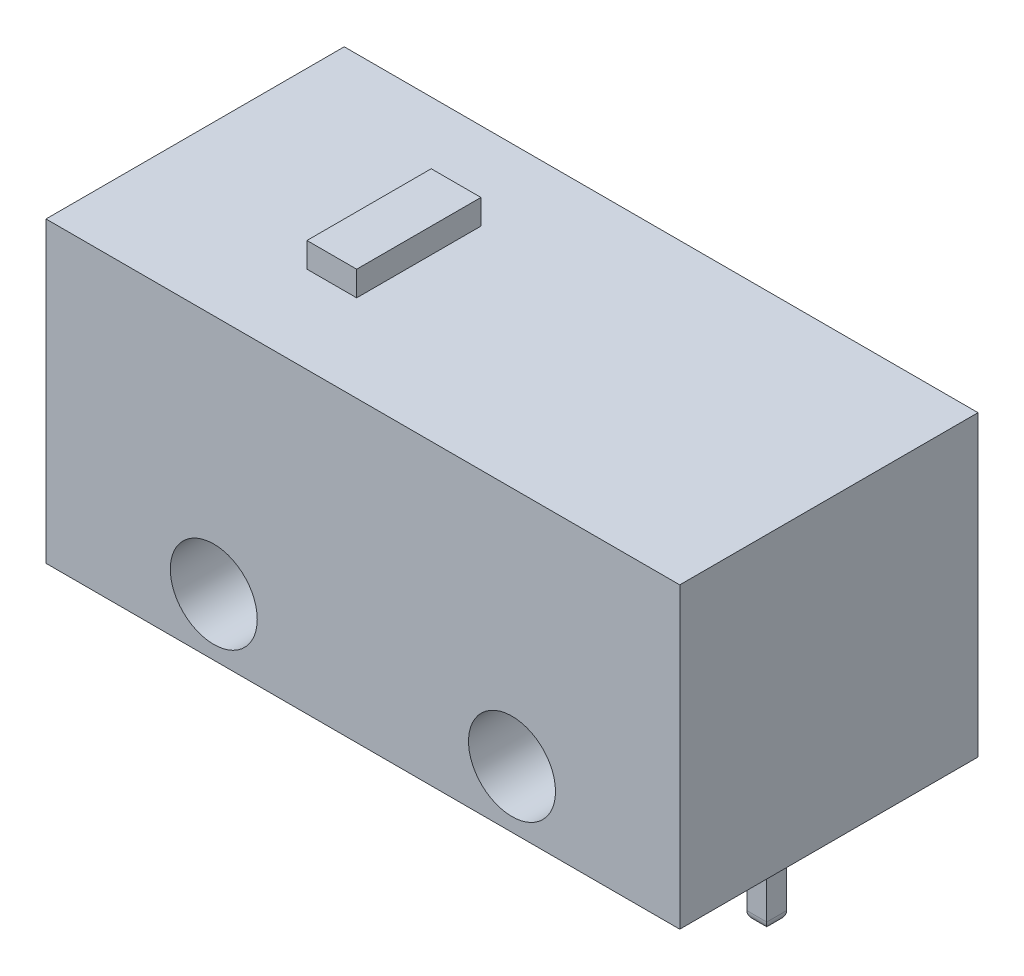
ISO-10303-21;
HEADER;
FILE_DESCRIPTION(('STEP AP214'),'2;1');
FILE_NAME('part.step','',(''),(''),'','','');
FILE_SCHEMA(('AUTOMOTIVE_DESIGN { 1 0 10303 214 1 1 1 1 }'));
ENDSEC;
DATA;
#1=APPLICATION_CONTEXT('core data for automotive mechanical design processes');
#2=APPLICATION_PROTOCOL_DEFINITION('international standard','automotive_design',2000,#1);
#3=PRODUCT_CONTEXT('',#1,'mechanical');
#4=PRODUCT('Part','Part','',(#3));
#5=PRODUCT_RELATED_PRODUCT_CATEGORY('part','',(#4));
#6=PRODUCT_DEFINITION_FORMATION('','',#4);
#7=PRODUCT_DEFINITION_CONTEXT('part definition',#1,'design');
#8=PRODUCT_DEFINITION('design','',#6,#7);
#9=PRODUCT_DEFINITION_SHAPE('','',#8);
#10=(LENGTH_UNIT() NAMED_UNIT(*) SI_UNIT(.MILLI.,.METRE.));
#11=(NAMED_UNIT(*) PLANE_ANGLE_UNIT() SI_UNIT($,.RADIAN.));
#12=(NAMED_UNIT(*) SI_UNIT($,.STERADIAN.) SOLID_ANGLE_UNIT());
#13=UNCERTAINTY_MEASURE_WITH_UNIT(LENGTH_MEASURE(1.E-05),#10,'distance_accuracy_value','');
#14=(GEOMETRIC_REPRESENTATION_CONTEXT(3) GLOBAL_UNCERTAINTY_ASSIGNED_CONTEXT((#13)) GLOBAL_UNIT_ASSIGNED_CONTEXT((#10,
#11,#12)) REPRESENTATION_CONTEXT('',''));
#15=CARTESIAN_POINT('',(0.,0.,0.));
#16=DIRECTION('',(0.,0.,1.));
#17=DIRECTION('',(1.,0.,0.));
#18=AXIS2_PLACEMENT_3D('',#15,#16,#17);
#19=CARTESIAN_POINT('',(0.,0.,6.));
#20=DIRECTION('',(0.,1.,0.));
#21=DIRECTION('',(0.,0.,1.));
#22=AXIS2_PLACEMENT_3D('',#19,#20,#21);
#23=PLANE('',#22);
#24=DIRECTION('',(1.,0.,0.));
#25=VECTOR('',#24,1.);
#26=CARTESIAN_POINT('',(1.05,0.,2.8));
#27=LINE('',#26,#25);
#28=CARTESIAN_POINT('',(1.05,0.,2.8));
#29=VERTEX_POINT('',#28);
#30=CARTESIAN_POINT('',(1.45,0.,2.8));
#31=VERTEX_POINT('',#30);
#32=EDGE_CURVE('E274',#29,#31,#27,.T.);
#33=ORIENTED_EDGE('',*,*,#32,.F.);
#34=DIRECTION('',(0.,0.,1.));
#35=VECTOR('',#34,1.);
#36=CARTESIAN_POINT('',(1.05,0.,2.8));
#37=LINE('',#36,#35);
#38=CARTESIAN_POINT('',(1.05,0.,3.2));
#39=VERTEX_POINT('',#38);
#40=EDGE_CURVE('E265',#29,#39,#37,.T.);
#41=ORIENTED_EDGE('',*,*,#40,.T.);
#42=DIRECTION('',(1.,0.,0.));
#43=VECTOR('',#42,1.);
#44=CARTESIAN_POINT('',(1.05,0.,3.2));
#45=LINE('',#44,#43);
#46=CARTESIAN_POINT('',(1.45,0.,3.2));
#47=VERTEX_POINT('',#46);
#48=EDGE_CURVE('E268',#39,#47,#45,.T.);
#49=ORIENTED_EDGE('',*,*,#48,.T.);
#50=DIRECTION('',(0.,0.,-1.));
#51=VECTOR('',#50,1.);
#52=CARTESIAN_POINT('',(1.45,0.,3.2));
#53=LINE('',#52,#51);
#54=EDGE_CURVE('E271',#47,#31,#53,.T.);
#55=ORIENTED_EDGE('',*,*,#54,.T.);
#56=EDGE_LOOP('',(#33,#41,#49,#55));
#57=FACE_BOUND('',#56,.T.);
#58=DIRECTION('',(1.,0.,0.));
#59=VECTOR('',#58,1.);
#60=CARTESIAN_POINT('',(0.,0.,0.));
#61=LINE('',#60,#59);
#62=CARTESIAN_POINT('',(0.,0.,0.));
#63=VERTEX_POINT('',#62);
#64=CARTESIAN_POINT('',(12.75,0.,0.));
#65=VERTEX_POINT('',#64);
#66=EDGE_CURVE('E166',#63,#65,#61,.T.);
#67=ORIENTED_EDGE('',*,*,#66,.T.);
#68=DIRECTION('',(0.,0.,-1.));
#69=VECTOR('',#68,1.);
#70=CARTESIAN_POINT('',(12.75,0.,6.));
#71=LINE('',#70,#69);
#72=CARTESIAN_POINT('',(12.75,0.,6.));
#73=VERTEX_POINT('',#72);
#74=EDGE_CURVE('E149',#73,#65,#71,.T.);
#75=ORIENTED_EDGE('',*,*,#74,.F.);
#76=DIRECTION('',(1.,0.,0.));
#77=VECTOR('',#76,1.);
#78=CARTESIAN_POINT('',(0.,0.,6.));
#79=LINE('',#78,#77);
#80=CARTESIAN_POINT('',(0.,0.,6.));
#81=VERTEX_POINT('',#80);
#82=EDGE_CURVE('E178',#81,#73,#79,.T.);
#83=ORIENTED_EDGE('',*,*,#82,.F.);
#84=DIRECTION('',(0.,0.,-1.));
#85=VECTOR('',#84,1.);
#86=CARTESIAN_POINT('',(0.,0.,6.));
#87=LINE('',#86,#85);
#88=EDGE_CURVE('E146',#81,#63,#87,.T.);
#89=ORIENTED_EDGE('',*,*,#88,.T.);
#90=EDGE_LOOP('',(#67,#75,#83,#89));
#91=FACE_BOUND('',#90,.T.);
#92=DIRECTION('',(1.,0.,0.));
#93=VECTOR('',#92,1.);
#94=CARTESIAN_POINT('',(6.175,0.,2.8));
#95=LINE('',#94,#93);
#96=CARTESIAN_POINT('',(6.175,0.,2.8));
#97=VERTEX_POINT('',#96);
#98=CARTESIAN_POINT('',(6.575,0.,2.8));
#99=VERTEX_POINT('',#98);
#100=EDGE_CURVE('E251',#97,#99,#95,.T.);
#101=ORIENTED_EDGE('',*,*,#100,.F.);
#102=DIRECTION('',(0.,0.,1.));
#103=VECTOR('',#102,1.);
#104=CARTESIAN_POINT('',(6.175,0.,2.8));
#105=LINE('',#104,#103);
#106=CARTESIAN_POINT('',(6.175,0.,3.2));
#107=VERTEX_POINT('',#106);
#108=EDGE_CURVE('E242',#97,#107,#105,.T.);
#109=ORIENTED_EDGE('',*,*,#108,.T.);
#110=DIRECTION('',(1.,0.,0.));
#111=VECTOR('',#110,1.);
#112=CARTESIAN_POINT('',(6.175,0.,3.2));
#113=LINE('',#112,#111);
#114=CARTESIAN_POINT('',(6.575,0.,3.2));
#115=VERTEX_POINT('',#114);
#116=EDGE_CURVE('E245',#107,#115,#113,.T.);
#117=ORIENTED_EDGE('',*,*,#116,.T.);
#118=DIRECTION('',(0.,0.,-1.));
#119=VECTOR('',#118,1.);
#120=CARTESIAN_POINT('',(6.575,0.,3.2));
#121=LINE('',#120,#119);
#122=EDGE_CURVE('E248',#115,#99,#121,.T.);
#123=ORIENTED_EDGE('',*,*,#122,.T.);
#124=EDGE_LOOP('',(#101,#109,#117,#123));
#125=FACE_BOUND('',#124,.T.);
#126=DIRECTION('',(1.,0.,0.));
#127=VECTOR('',#126,1.);
#128=CARTESIAN_POINT('',(11.7,0.,3.2));
#129=LINE('',#128,#127);
#130=CARTESIAN_POINT('',(11.7,0.,3.2));
#131=VERTEX_POINT('',#130);
#132=CARTESIAN_POINT('',(11.3,0.,3.2));
#133=VERTEX_POINT('',#132);
#134=EDGE_CURVE('E110',#131,#133,#129,.F.);
#135=ORIENTED_EDGE('',*,*,#134,.F.);
#136=DIRECTION('',(0.,0.,-1.));
#137=VECTOR('',#136,1.);
#138=CARTESIAN_POINT('',(11.7,0.,3.2));
#139=LINE('',#138,#137);
#140=CARTESIAN_POINT('',(11.7,0.,2.8));
#141=VERTEX_POINT('',#140);
#142=EDGE_CURVE('E289',#131,#141,#139,.T.);
#143=ORIENTED_EDGE('',*,*,#142,.T.);
#144=DIRECTION('',(1.,0.,0.));
#145=VECTOR('',#144,1.);
#146=CARTESIAN_POINT('',(11.7,0.,2.8));
#147=LINE('',#146,#145);
#148=CARTESIAN_POINT('',(11.3,0.,2.8));
#149=VERTEX_POINT('',#148);
#150=EDGE_CURVE('E292',#141,#149,#147,.F.);
#151=ORIENTED_EDGE('',*,*,#150,.T.);
#152=DIRECTION('',(0.,0.,1.));
#153=VECTOR('',#152,1.);
#154=CARTESIAN_POINT('',(11.3,0.,2.8));
#155=LINE('',#154,#153);
#156=EDGE_CURVE('E295',#149,#133,#155,.T.);
#157=ORIENTED_EDGE('',*,*,#156,.T.);
#158=EDGE_LOOP('',(#135,#143,#151,#157));
#159=FACE_BOUND('',#158,.T.);
#160=ADVANCED_FACE('F33',(#57,#91,#125,#159),#23,.F.);
#161=CARTESIAN_POINT('',(0.,6.,6.));
#162=DIRECTION('',(0.,-1.,0.));
#163=DIRECTION('',(0.,0.,-1.));
#164=AXIS2_PLACEMENT_3D('',#161,#162,#163);
#165=PLANE('',#164);
#166=DIRECTION('',(-1.,0.,0.));
#167=VECTOR('',#166,1.);
#168=CARTESIAN_POINT('',(0.,6.,0.));
#169=LINE('',#168,#167);
#170=CARTESIAN_POINT('',(12.75,6.,0.));
#171=VERTEX_POINT('',#170);
#172=CARTESIAN_POINT('',(0.,6.,0.));
#173=VERTEX_POINT('',#172);
#174=EDGE_CURVE('E159',#171,#173,#169,.T.);
#175=ORIENTED_EDGE('',*,*,#174,.T.);
#176=DIRECTION('',(0.,0.,-1.));
#177=VECTOR('',#176,1.);
#178=CARTESIAN_POINT('',(0.,6.,6.));
#179=LINE('',#178,#177);
#180=CARTESIAN_POINT('',(0.,6.,6.));
#181=VERTEX_POINT('',#180);
#182=EDGE_CURVE('E155',#181,#173,#179,.T.);
#183=ORIENTED_EDGE('',*,*,#182,.F.);
#184=DIRECTION('',(-1.,0.,0.));
#185=VECTOR('',#184,1.);
#186=CARTESIAN_POINT('',(0.,6.,6.));
#187=LINE('',#186,#185);
#188=CARTESIAN_POINT('',(12.75,6.,6.));
#189=VERTEX_POINT('',#188);
#190=EDGE_CURVE('E158',#189,#181,#187,.T.);
#191=ORIENTED_EDGE('',*,*,#190,.F.);
#192=DIRECTION('',(0.,0.,-1.));
#193=VECTOR('',#192,1.);
#194=CARTESIAN_POINT('',(12.75,6.,6.));
#195=LINE('',#194,#193);
#196=EDGE_CURVE('E152',#189,#171,#195,.T.);
#197=ORIENTED_EDGE('',*,*,#196,.T.);
#198=EDGE_LOOP('',(#175,#183,#191,#197));
#199=FACE_BOUND('',#198,.T.);
#200=DIRECTION('',(0.,0.,1.));
#201=VECTOR('',#200,1.);
#202=CARTESIAN_POINT('',(3.5,6.,1.75));
#203=LINE('',#202,#201);
#204=CARTESIAN_POINT('',(3.5,6.,1.75));
#205=VERTEX_POINT('',#204);
#206=CARTESIAN_POINT('',(3.5,6.,4.25));
#207=VERTEX_POINT('',#206);
#208=EDGE_CURVE('E217',#205,#207,#203,.T.);
#209=ORIENTED_EDGE('',*,*,#208,.F.);
#210=DIRECTION('',(-1.,0.,0.));
#211=VECTOR('',#210,1.);
#212=CARTESIAN_POINT('',(3.5,6.,1.75));
#213=LINE('',#212,#211);
#214=CARTESIAN_POINT('',(4.5,6.,1.75));
#215=VERTEX_POINT('',#214);
#216=EDGE_CURVE('E207',#215,#205,#213,.T.);
#217=ORIENTED_EDGE('',*,*,#216,.F.);
#218=DIRECTION('',(0.,0.,-1.));
#219=VECTOR('',#218,1.);
#220=CARTESIAN_POINT('',(4.5,6.,1.75));
#221=LINE('',#220,#219);
#222=CARTESIAN_POINT('',(4.5,6.,4.25));
#223=VERTEX_POINT('',#222);
#224=EDGE_CURVE('E211',#223,#215,#221,.T.);
#225=ORIENTED_EDGE('',*,*,#224,.F.);
#226=DIRECTION('',(1.,0.,0.));
#227=VECTOR('',#226,1.);
#228=CARTESIAN_POINT('',(3.5,6.,4.25));
#229=LINE('',#228,#227);
#230=EDGE_CURVE('E214',#207,#223,#229,.T.);
#231=ORIENTED_EDGE('',*,*,#230,.F.);
#232=EDGE_LOOP('',(#209,#217,#225,#231));
#233=FACE_BOUND('',#232,.T.);
#234=ADVANCED_FACE('F417',(#199,#233),#165,.F.);
#235=CARTESIAN_POINT('',(0.,0.,6.));
#236=DIRECTION('',(1.,0.,0.));
#237=DIRECTION('',(0.,0.,-1.));
#238=AXIS2_PLACEMENT_3D('',#235,#236,#237);
#239=PLANE('',#238);
#240=DIRECTION('',(0.,-1.,0.));
#241=VECTOR('',#240,1.);
#242=CARTESIAN_POINT('',(0.,0.,0.));
#243=LINE('',#242,#241);
#244=EDGE_CURVE('E169',#173,#63,#243,.T.);
#245=ORIENTED_EDGE('',*,*,#244,.T.);
#246=ORIENTED_EDGE('',*,*,#88,.F.);
#247=DIRECTION('',(0.,-1.,0.));
#248=VECTOR('',#247,1.);
#249=CARTESIAN_POINT('',(0.,0.,6.));
#250=LINE('',#249,#248);
#251=EDGE_CURVE('E162',#181,#81,#250,.T.);
#252=ORIENTED_EDGE('',*,*,#251,.F.);
#253=ORIENTED_EDGE('',*,*,#182,.T.);
#254=EDGE_LOOP('',(#245,#246,#252,#253));
#255=FACE_BOUND('',#254,.T.);
#256=ADVANCED_FACE('F422',(#255),#239,.F.);
#257=CARTESIAN_POINT('',(12.75,0.,6.));
#258=DIRECTION('',(-1.,0.,0.));
#259=DIRECTION('',(0.,0.,1.));
#260=AXIS2_PLACEMENT_3D('',#257,#258,#259);
#261=PLANE('',#260);
#262=DIRECTION('',(0.,1.,0.));
#263=VECTOR('',#262,1.);
#264=CARTESIAN_POINT('',(12.75,0.,0.));
#265=LINE('',#264,#263);
#266=EDGE_CURVE('E163',#65,#171,#265,.T.);
#267=ORIENTED_EDGE('',*,*,#266,.T.);
#268=ORIENTED_EDGE('',*,*,#196,.F.);
#269=DIRECTION('',(0.,1.,0.));
#270=VECTOR('',#269,1.);
#271=CARTESIAN_POINT('',(12.75,0.,6.));
#272=LINE('',#271,#270);
#273=EDGE_CURVE('E175',#73,#189,#272,.T.);
#274=ORIENTED_EDGE('',*,*,#273,.F.);
#275=ORIENTED_EDGE('',*,*,#74,.T.);
#276=EDGE_LOOP('',(#267,#268,#274,#275));
#277=FACE_BOUND('',#276,.T.);
#278=ADVANCED_FACE('F427',(#277),#261,.F.);
#279=CARTESIAN_POINT('',(0.,0.,6.));
#280=DIRECTION('',(0.,0.,-1.));
#281=DIRECTION('',(-1.,0.,0.));
#282=AXIS2_PLACEMENT_3D('',#279,#280,#281);
#283=PLANE('',#282);
#284=CARTESIAN_POINT('',(3.375,1.15,6.));
#285=DIRECTION('',(0.,0.,1.));
#286=DIRECTION('',(1.,0.,0.));
#287=AXIS2_PLACEMENT_3D('',#284,#285,#286);
#288=CIRCLE('',#287,0.874999999999999);
#289=CARTESIAN_POINT('',(4.25,1.15,6.));
#290=VERTEX_POINT('',#289);
#291=EDGE_CURVE('E191',#290,#290,#288,.T.);
#292=ORIENTED_EDGE('',*,*,#291,.F.);
#293=EDGE_LOOP('',(#292));
#294=FACE_BOUND('',#293,.T.);
#295=CARTESIAN_POINT('',(9.375,1.15,6.));
#296=DIRECTION('',(0.,0.,1.));
#297=DIRECTION('',(1.,0.,0.));
#298=AXIS2_PLACEMENT_3D('',#295,#296,#297);
#299=CIRCLE('',#298,0.874999999999999);
#300=CARTESIAN_POINT('',(10.25,1.15,6.));
#301=VERTEX_POINT('',#300);
#302=EDGE_CURVE('E185',#301,#301,#299,.T.);
#303=ORIENTED_EDGE('',*,*,#302,.F.);
#304=EDGE_LOOP('',(#303));
#305=FACE_BOUND('',#304,.T.);
#306=ORIENTED_EDGE('',*,*,#251,.T.);
#307=ORIENTED_EDGE('',*,*,#82,.T.);
#308=ORIENTED_EDGE('',*,*,#273,.T.);
#309=ORIENTED_EDGE('',*,*,#190,.T.);
#310=EDGE_LOOP('',(#306,#307,#308,#309));
#311=FACE_BOUND('',#310,.T.);
#312=ADVANCED_FACE('F682',(#294,#305,#311),#283,.F.);
#313=CARTESIAN_POINT('',(0.,0.,0.));
#314=DIRECTION('',(0.,0.,-1.));
#315=DIRECTION('',(-1.,0.,0.));
#316=AXIS2_PLACEMENT_3D('',#313,#314,#315);
#317=PLANE('',#316);
#318=CARTESIAN_POINT('',(3.375,1.15,0.));
#319=DIRECTION('',(0.,0.,1.));
#320=DIRECTION('',(1.,0.,0.));
#321=AXIS2_PLACEMENT_3D('',#318,#319,#320);
#322=CIRCLE('',#321,0.874999999999999);
#323=CARTESIAN_POINT('',(4.25,1.15,0.));
#324=VERTEX_POINT('',#323);
#325=EDGE_CURVE('E188',#324,#324,#322,.T.);
#326=ORIENTED_EDGE('',*,*,#325,.T.);
#327=EDGE_LOOP('',(#326));
#328=FACE_BOUND('',#327,.T.);
#329=CARTESIAN_POINT('',(9.375,1.15,0.));
#330=DIRECTION('',(0.,0.,1.));
#331=DIRECTION('',(1.,0.,0.));
#332=AXIS2_PLACEMENT_3D('',#329,#330,#331);
#333=CIRCLE('',#332,0.874999999999999);
#334=CARTESIAN_POINT('',(10.25,1.15,0.));
#335=VERTEX_POINT('',#334);
#336=EDGE_CURVE('E172',#335,#335,#333,.T.);
#337=ORIENTED_EDGE('',*,*,#336,.T.);
#338=EDGE_LOOP('',(#337));
#339=FACE_BOUND('',#338,.T.);
#340=ORIENTED_EDGE('',*,*,#244,.F.);
#341=ORIENTED_EDGE('',*,*,#174,.F.);
#342=ORIENTED_EDGE('',*,*,#266,.F.);
#343=ORIENTED_EDGE('',*,*,#66,.F.);
#344=EDGE_LOOP('',(#340,#341,#342,#343));
#345=FACE_BOUND('',#344,.T.);
#346=ADVANCED_FACE('F672',(#328,#339,#345),#317,.T.);
#347=CARTESIAN_POINT('',(9.375,1.15,6.));
#348=DIRECTION('',(0.,0.,1.));
#349=DIRECTION('',(1.,0.,0.));
#350=AXIS2_PLACEMENT_3D('',#347,#348,#349);
#351=CYLINDRICAL_SURFACE('',#350,0.874999999999999);
#352=ORIENTED_EDGE('',*,*,#336,.F.);
#353=EDGE_LOOP('',(#352));
#354=FACE_BOUND('',#353,.T.);
#355=ORIENTED_EDGE('',*,*,#302,.T.);
#356=EDGE_LOOP('',(#355));
#357=FACE_BOUND('',#356,.T.);
#358=ADVANCED_FACE('F662',(#354,#357),#351,.F.);
#359=CARTESIAN_POINT('',(3.375,1.15,6.));
#360=DIRECTION('',(0.,0.,1.));
#361=DIRECTION('',(1.,0.,0.));
#362=AXIS2_PLACEMENT_3D('',#359,#360,#361);
#363=CYLINDRICAL_SURFACE('',#362,0.874999999999999);
#364=ORIENTED_EDGE('',*,*,#325,.F.);
#365=EDGE_LOOP('',(#364));
#366=FACE_BOUND('',#365,.T.);
#367=ORIENTED_EDGE('',*,*,#291,.T.);
#368=EDGE_LOOP('',(#367));
#369=FACE_BOUND('',#368,.T.);
#370=ADVANCED_FACE('F646',(#366,#369),#363,.F.);
#371=CARTESIAN_POINT('',(3.5,6.5,1.75));
#372=DIRECTION('',(1.,0.,0.));
#373=DIRECTION('',(0.,0.,-1.));
#374=AXIS2_PLACEMENT_3D('',#371,#372,#373);
#375=PLANE('',#374);
#376=ORIENTED_EDGE('',*,*,#208,.T.);
#377=DIRECTION('',(0.,-1.,0.));
#378=VECTOR('',#377,1.);
#379=CARTESIAN_POINT('',(3.5,6.5,4.25));
#380=LINE('',#379,#378);
#381=CARTESIAN_POINT('',(3.5,6.5,4.25));
#382=VERTEX_POINT('',#381);
#383=EDGE_CURVE('E194',#382,#207,#380,.T.);
#384=ORIENTED_EDGE('',*,*,#383,.F.);
#385=DIRECTION('',(0.,0.,1.));
#386=VECTOR('',#385,1.);
#387=CARTESIAN_POINT('',(3.5,6.5,1.75));
#388=LINE('',#387,#386);
#389=CARTESIAN_POINT('',(3.5,6.5,1.75));
#390=VERTEX_POINT('',#389);
#391=EDGE_CURVE('E210',#390,#382,#388,.T.);
#392=ORIENTED_EDGE('',*,*,#391,.F.);
#393=DIRECTION('',(0.,-1.,0.));
#394=VECTOR('',#393,1.);
#395=CARTESIAN_POINT('',(3.5,6.5,1.75));
#396=LINE('',#395,#394);
#397=EDGE_CURVE('E203',#390,#205,#396,.T.);
#398=ORIENTED_EDGE('',*,*,#397,.T.);
#399=EDGE_LOOP('',(#376,#384,#392,#398));
#400=FACE_BOUND('',#399,.T.);
#401=ADVANCED_FACE('F636',(#400),#375,.F.);
#402=CARTESIAN_POINT('',(3.5,6.5,4.25));
#403=DIRECTION('',(0.,0.,-1.));
#404=DIRECTION('',(-1.,0.,0.));
#405=AXIS2_PLACEMENT_3D('',#402,#403,#404);
#406=PLANE('',#405);
#407=ORIENTED_EDGE('',*,*,#230,.T.);
#408=DIRECTION('',(0.,-1.,0.));
#409=VECTOR('',#408,1.);
#410=CARTESIAN_POINT('',(4.5,6.5,4.25));
#411=LINE('',#410,#409);
#412=CARTESIAN_POINT('',(4.5,6.5,4.25));
#413=VERTEX_POINT('',#412);
#414=EDGE_CURVE('E197',#413,#223,#411,.T.);
#415=ORIENTED_EDGE('',*,*,#414,.F.);
#416=DIRECTION('',(1.,0.,0.));
#417=VECTOR('',#416,1.);
#418=CARTESIAN_POINT('',(3.5,6.5,4.25));
#419=LINE('',#418,#417);
#420=EDGE_CURVE('E226',#382,#413,#419,.T.);
#421=ORIENTED_EDGE('',*,*,#420,.F.);
#422=ORIENTED_EDGE('',*,*,#383,.T.);
#423=EDGE_LOOP('',(#407,#415,#421,#422));
#424=FACE_BOUND('',#423,.T.);
#425=ADVANCED_FACE('F626',(#424),#406,.F.);
#426=CARTESIAN_POINT('',(4.5,6.5,1.75));
#427=DIRECTION('',(-1.,0.,0.));
#428=DIRECTION('',(0.,0.,1.));
#429=AXIS2_PLACEMENT_3D('',#426,#427,#428);
#430=PLANE('',#429);
#431=ORIENTED_EDGE('',*,*,#224,.T.);
#432=DIRECTION('',(0.,-1.,0.));
#433=VECTOR('',#432,1.);
#434=CARTESIAN_POINT('',(4.5,6.5,1.75));
#435=LINE('',#434,#433);
#436=CARTESIAN_POINT('',(4.5,6.5,1.75));
#437=VERTEX_POINT('',#436);
#438=EDGE_CURVE('E200',#437,#215,#435,.T.);
#439=ORIENTED_EDGE('',*,*,#438,.F.);
#440=DIRECTION('',(0.,0.,-1.));
#441=VECTOR('',#440,1.);
#442=CARTESIAN_POINT('',(4.5,6.5,1.75));
#443=LINE('',#442,#441);
#444=EDGE_CURVE('E223',#413,#437,#443,.T.);
#445=ORIENTED_EDGE('',*,*,#444,.F.);
#446=ORIENTED_EDGE('',*,*,#414,.T.);
#447=EDGE_LOOP('',(#431,#439,#445,#446));
#448=FACE_BOUND('',#447,.T.);
#449=ADVANCED_FACE('F616',(#448),#430,.F.);
#450=CARTESIAN_POINT('',(3.5,6.5,1.75));
#451=DIRECTION('',(0.,0.,1.));
#452=DIRECTION('',(1.,0.,0.));
#453=AXIS2_PLACEMENT_3D('',#450,#451,#452);
#454=PLANE('',#453);
#455=ORIENTED_EDGE('',*,*,#216,.T.);
#456=ORIENTED_EDGE('',*,*,#397,.F.);
#457=DIRECTION('',(-1.,0.,0.));
#458=VECTOR('',#457,1.);
#459=CARTESIAN_POINT('',(3.5,6.5,1.75));
#460=LINE('',#459,#458);
#461=EDGE_CURVE('E206',#437,#390,#460,.T.);
#462=ORIENTED_EDGE('',*,*,#461,.F.);
#463=ORIENTED_EDGE('',*,*,#438,.T.);
#464=EDGE_LOOP('',(#455,#456,#462,#463));
#465=FACE_BOUND('',#464,.T.);
#466=ADVANCED_FACE('F606',(#465),#454,.F.);
#467=CARTESIAN_POINT('',(0.,6.5,0.));
#468=DIRECTION('',(0.,1.,0.));
#469=DIRECTION('',(0.,0.,1.));
#470=AXIS2_PLACEMENT_3D('',#467,#468,#469);
#471=PLANE('',#470);
#472=ORIENTED_EDGE('',*,*,#391,.T.);
#473=ORIENTED_EDGE('',*,*,#420,.T.);
#474=ORIENTED_EDGE('',*,*,#444,.T.);
#475=ORIENTED_EDGE('',*,*,#461,.T.);
#476=EDGE_LOOP('',(#472,#473,#474,#475));
#477=FACE_BOUND('',#476,.T.);
#478=ADVANCED_FACE('F591',(#477),#471,.T.);
#479=CARTESIAN_POINT('',(6.175,-2.,2.8));
#480=DIRECTION('',(0.,0.,1.));
#481=DIRECTION('',(1.,0.,0.));
#482=AXIS2_PLACEMENT_3D('',#479,#480,#481);
#483=PLANE('',#482);
#484=DIRECTION('',(0.,1.,0.));
#485=VECTOR('',#484,1.);
#486=CARTESIAN_POINT('',(6.575,-2.,2.8));
#487=LINE('',#486,#485);
#488=CARTESIAN_POINT('',(6.575,-1.8,2.8));
#489=VERTEX_POINT('',#488);
#490=EDGE_CURVE('E220',#489,#99,#487,.T.);
#491=ORIENTED_EDGE('',*,*,#490,.F.);
#492=DIRECTION('',(1.,0.,0.));
#493=VECTOR('',#492,1.);
#494=CARTESIAN_POINT('',(6.175,-1.8,2.8));
#495=LINE('',#494,#493);
#496=CARTESIAN_POINT('',(6.175,-1.8,2.8));
#497=VERTEX_POINT('',#496);
#498=EDGE_CURVE('E122',#489,#497,#495,.F.);
#499=ORIENTED_EDGE('',*,*,#498,.T.);
#500=DIRECTION('',(0.,1.,0.));
#501=VECTOR('',#500,1.);
#502=CARTESIAN_POINT('',(6.175,-2.,2.8));
#503=LINE('',#502,#501);
#504=EDGE_CURVE('E239',#497,#97,#503,.T.);
#505=ORIENTED_EDGE('',*,*,#504,.T.);
#506=ORIENTED_EDGE('',*,*,#100,.T.);
#507=EDGE_LOOP('',(#491,#499,#505,#506));
#508=FACE_BOUND('',#507,.T.);
#509=ADVANCED_FACE('F582',(#508),#483,.F.);
#510=CARTESIAN_POINT('',(6.575,-2.,3.2));
#511=DIRECTION('',(1.,0.,0.));
#512=DIRECTION('',(0.,0.,-1.));
#513=AXIS2_PLACEMENT_3D('',#510,#511,#512);
#514=PLANE('',#513);
#515=DIRECTION('',(0.,1.,0.));
#516=VECTOR('',#515,1.);
#517=CARTESIAN_POINT('',(6.575,-2.,3.2));
#518=LINE('',#517,#516);
#519=CARTESIAN_POINT('',(6.575,-1.8,3.2));
#520=VERTEX_POINT('',#519);
#521=EDGE_CURVE('E233',#520,#115,#518,.T.);
#522=ORIENTED_EDGE('',*,*,#521,.F.);
#523=DIRECTION('',(0.,0.,-1.));
#524=VECTOR('',#523,1.);
#525=CARTESIAN_POINT('',(6.575,-1.8,2.8));
#526=LINE('',#525,#524);
#527=EDGE_CURVE('E125',#520,#489,#526,.T.);
#528=ORIENTED_EDGE('',*,*,#527,.T.);
#529=ORIENTED_EDGE('',*,*,#490,.T.);
#530=ORIENTED_EDGE('',*,*,#122,.F.);
#531=EDGE_LOOP('',(#522,#528,#529,#530));
#532=FACE_BOUND('',#531,.T.);
#533=ADVANCED_FACE('F572',(#532),#514,.T.);
#534=CARTESIAN_POINT('',(6.175,-2.,3.2));
#535=DIRECTION('',(0.,0.,1.));
#536=DIRECTION('',(1.,0.,0.));
#537=AXIS2_PLACEMENT_3D('',#534,#535,#536);
#538=PLANE('',#537);
#539=DIRECTION('',(0.,1.,0.));
#540=VECTOR('',#539,1.);
#541=CARTESIAN_POINT('',(6.175,-2.,3.2));
#542=LINE('',#541,#540);
#543=CARTESIAN_POINT('',(6.175,-1.8,3.2));
#544=VERTEX_POINT('',#543);
#545=EDGE_CURVE('E236',#544,#107,#542,.T.);
#546=ORIENTED_EDGE('',*,*,#545,.F.);
#547=DIRECTION('',(1.,0.,0.));
#548=VECTOR('',#547,1.);
#549=CARTESIAN_POINT('',(6.575,-1.8,3.2));
#550=LINE('',#549,#548);
#551=EDGE_CURVE('E128',#544,#520,#550,.T.);
#552=ORIENTED_EDGE('',*,*,#551,.T.);
#553=ORIENTED_EDGE('',*,*,#521,.T.);
#554=ORIENTED_EDGE('',*,*,#116,.F.);
#555=EDGE_LOOP('',(#546,#552,#553,#554));
#556=FACE_BOUND('',#555,.T.);
#557=ADVANCED_FACE('F562',(#556),#538,.T.);
#558=CARTESIAN_POINT('',(6.175,-2.,2.8));
#559=DIRECTION('',(-1.,0.,0.));
#560=DIRECTION('',(0.,0.,1.));
#561=AXIS2_PLACEMENT_3D('',#558,#559,#560);
#562=PLANE('',#561);
#563=ORIENTED_EDGE('',*,*,#504,.F.);
#564=DIRECTION('',(0.,0.,1.));
#565=VECTOR('',#564,1.);
#566=CARTESIAN_POINT('',(6.175,-1.8,3.2));
#567=LINE('',#566,#565);
#568=EDGE_CURVE('E131',#497,#544,#567,.T.);
#569=ORIENTED_EDGE('',*,*,#568,.T.);
#570=ORIENTED_EDGE('',*,*,#545,.T.);
#571=ORIENTED_EDGE('',*,*,#108,.F.);
#572=EDGE_LOOP('',(#563,#569,#570,#571));
#573=FACE_BOUND('',#572,.T.);
#574=ADVANCED_FACE('F553',(#573),#562,.T.);
#575=CARTESIAN_POINT('',(1.05,-2.,2.8));
#576=DIRECTION('',(0.,0.,1.));
#577=DIRECTION('',(1.,0.,0.));
#578=AXIS2_PLACEMENT_3D('',#575,#576,#577);
#579=PLANE('',#578);
#580=DIRECTION('',(0.,1.,0.));
#581=VECTOR('',#580,1.);
#582=CARTESIAN_POINT('',(1.45,-2.,2.8));
#583=LINE('',#582,#581);
#584=CARTESIAN_POINT('',(1.45,-1.8,2.8));
#585=VERTEX_POINT('',#584);
#586=EDGE_CURVE('E254',#585,#31,#583,.T.);
#587=ORIENTED_EDGE('',*,*,#586,.F.);
#588=DIRECTION('',(1.,0.,0.));
#589=VECTOR('',#588,1.);
#590=CARTESIAN_POINT('',(1.05,-1.8,2.8));
#591=LINE('',#590,#589);
#592=CARTESIAN_POINT('',(1.05,-1.8,2.8));
#593=VERTEX_POINT('',#592);
#594=EDGE_CURVE('E11',#585,#593,#591,.F.);
#595=ORIENTED_EDGE('',*,*,#594,.T.);
#596=DIRECTION('',(0.,1.,0.));
#597=VECTOR('',#596,1.);
#598=CARTESIAN_POINT('',(1.05,-2.,2.8));
#599=LINE('',#598,#597);
#600=EDGE_CURVE('E262',#593,#29,#599,.T.);
#601=ORIENTED_EDGE('',*,*,#600,.T.);
#602=ORIENTED_EDGE('',*,*,#32,.T.);
#603=EDGE_LOOP('',(#587,#595,#601,#602));
#604=FACE_BOUND('',#603,.T.);
#605=ADVANCED_FACE('F395',(#604),#579,.F.);
#606=CARTESIAN_POINT('',(1.45,-2.,3.2));
#607=DIRECTION('',(1.,0.,0.));
#608=DIRECTION('',(0.,0.,-1.));
#609=AXIS2_PLACEMENT_3D('',#606,#607,#608);
#610=PLANE('',#609);
#611=DIRECTION('',(0.,1.,0.));
#612=VECTOR('',#611,1.);
#613=CARTESIAN_POINT('',(1.45,-2.,3.2));
#614=LINE('',#613,#612);
#615=CARTESIAN_POINT('',(1.45,-1.8,3.2));
#616=VERTEX_POINT('',#615);
#617=EDGE_CURVE('E256',#616,#47,#614,.T.);
#618=ORIENTED_EDGE('',*,*,#617,.F.);
#619=DIRECTION('',(0.,0.,-1.));
#620=VECTOR('',#619,1.);
#621=CARTESIAN_POINT('',(1.45,-1.8,2.8));
#622=LINE('',#621,#620);
#623=EDGE_CURVE('E43',#616,#585,#622,.T.);
#624=ORIENTED_EDGE('',*,*,#623,.T.);
#625=ORIENTED_EDGE('',*,*,#586,.T.);
#626=ORIENTED_EDGE('',*,*,#54,.F.);
#627=EDGE_LOOP('',(#618,#624,#625,#626));
#628=FACE_BOUND('',#627,.T.);
#629=ADVANCED_FACE('F405',(#628),#610,.T.);
#630=CARTESIAN_POINT('',(1.05,-2.,3.2));
#631=DIRECTION('',(0.,0.,1.));
#632=DIRECTION('',(1.,0.,0.));
#633=AXIS2_PLACEMENT_3D('',#630,#631,#632);
#634=PLANE('',#633);
#635=DIRECTION('',(0.,1.,0.));
#636=VECTOR('',#635,1.);
#637=CARTESIAN_POINT('',(1.05,-2.,3.2));
#638=LINE('',#637,#636);
#639=CARTESIAN_POINT('',(1.05,-1.8,3.2));
#640=VERTEX_POINT('',#639);
#641=EDGE_CURVE('E259',#640,#39,#638,.T.);
#642=ORIENTED_EDGE('',*,*,#641,.F.);
#643=DIRECTION('',(1.,0.,0.));
#644=VECTOR('',#643,1.);
#645=CARTESIAN_POINT('',(1.45,-1.8,3.2));
#646=LINE('',#645,#644);
#647=EDGE_CURVE('E95',#640,#616,#646,.T.);
#648=ORIENTED_EDGE('',*,*,#647,.T.);
#649=ORIENTED_EDGE('',*,*,#617,.T.);
#650=ORIENTED_EDGE('',*,*,#48,.F.);
#651=EDGE_LOOP('',(#642,#648,#649,#650));
#652=FACE_BOUND('',#651,.T.);
#653=ADVANCED_FACE('F407',(#652),#634,.T.);
#654=CARTESIAN_POINT('',(1.05,-2.,2.8));
#655=DIRECTION('',(-1.,0.,0.));
#656=DIRECTION('',(0.,0.,1.));
#657=AXIS2_PLACEMENT_3D('',#654,#655,#656);
#658=PLANE('',#657);
#659=ORIENTED_EDGE('',*,*,#600,.F.);
#660=DIRECTION('',(0.,0.,1.));
#661=VECTOR('',#660,1.);
#662=CARTESIAN_POINT('',(1.05,-1.8,3.2));
#663=LINE('',#662,#661);
#664=EDGE_CURVE('E92',#593,#640,#663,.T.);
#665=ORIENTED_EDGE('',*,*,#664,.T.);
#666=ORIENTED_EDGE('',*,*,#641,.T.);
#667=ORIENTED_EDGE('',*,*,#40,.F.);
#668=EDGE_LOOP('',(#659,#665,#666,#667));
#669=FACE_BOUND('',#668,.T.);
#670=ADVANCED_FACE('F398',(#669),#658,.T.);
#671=CARTESIAN_POINT('',(11.7,-2.,3.2));
#672=DIRECTION('',(0.,0.,-1.));
#673=DIRECTION('',(-1.,0.,0.));
#674=AXIS2_PLACEMENT_3D('',#671,#672,#673);
#675=PLANE('',#674);
#676=DIRECTION('',(0.,1.,0.));
#677=VECTOR('',#676,1.);
#678=CARTESIAN_POINT('',(11.3,-2.,3.2));
#679=LINE('',#678,#677);
#680=CARTESIAN_POINT('',(11.3,-1.8,3.2));
#681=VERTEX_POINT('',#680);
#682=EDGE_CURVE('E277',#681,#133,#679,.T.);
#683=ORIENTED_EDGE('',*,*,#682,.F.);
#684=DIRECTION('',(-1.,0.,0.));
#685=VECTOR('',#684,1.);
#686=CARTESIAN_POINT('',(11.7,-1.8,3.2));
#687=LINE('',#686,#685);
#688=CARTESIAN_POINT('',(11.7,-1.8,3.2));
#689=VERTEX_POINT('',#688);
#690=EDGE_CURVE('E134',#681,#689,#687,.F.);
#691=ORIENTED_EDGE('',*,*,#690,.T.);
#692=DIRECTION('',(0.,1.,0.));
#693=VECTOR('',#692,1.);
#694=CARTESIAN_POINT('',(11.7,-2.,3.2));
#695=LINE('',#694,#693);
#696=EDGE_CURVE('E286',#689,#131,#695,.T.);
#697=ORIENTED_EDGE('',*,*,#696,.T.);
#698=ORIENTED_EDGE('',*,*,#134,.T.);
#699=EDGE_LOOP('',(#683,#691,#697,#698));
#700=FACE_BOUND('',#699,.T.);
#701=ADVANCED_FACE('F302',(#700),#675,.F.);
#702=CARTESIAN_POINT('',(11.3,-2.,2.8));
#703=DIRECTION('',(-1.,0.,0.));
#704=DIRECTION('',(0.,0.,1.));
#705=AXIS2_PLACEMENT_3D('',#702,#703,#704);
#706=PLANE('',#705);
#707=DIRECTION('',(0.,1.,0.));
#708=VECTOR('',#707,1.);
#709=CARTESIAN_POINT('',(11.3,-2.,2.8));
#710=LINE('',#709,#708);
#711=CARTESIAN_POINT('',(11.3,-1.8,2.8));
#712=VERTEX_POINT('',#711);
#713=EDGE_CURVE('E280',#712,#149,#710,.T.);
#714=ORIENTED_EDGE('',*,*,#713,.F.);
#715=DIRECTION('',(0.,0.,1.));
#716=VECTOR('',#715,1.);
#717=CARTESIAN_POINT('',(11.3,-1.8,2.8));
#718=LINE('',#717,#716);
#719=EDGE_CURVE('E137',#712,#681,#718,.T.);
#720=ORIENTED_EDGE('',*,*,#719,.T.);
#721=ORIENTED_EDGE('',*,*,#682,.T.);
#722=ORIENTED_EDGE('',*,*,#156,.F.);
#723=EDGE_LOOP('',(#714,#720,#721,#722));
#724=FACE_BOUND('',#723,.T.);
#725=ADVANCED_FACE('F315',(#724),#706,.T.);
#726=CARTESIAN_POINT('',(11.7,-2.,2.8));
#727=DIRECTION('',(0.,0.,-1.));
#728=DIRECTION('',(-1.,0.,0.));
#729=AXIS2_PLACEMENT_3D('',#726,#727,#728);
#730=PLANE('',#729);
#731=DIRECTION('',(0.,1.,0.));
#732=VECTOR('',#731,1.);
#733=CARTESIAN_POINT('',(11.7,-2.,2.8));
#734=LINE('',#733,#732);
#735=CARTESIAN_POINT('',(11.7,-1.8,2.8));
#736=VERTEX_POINT('',#735);
#737=EDGE_CURVE('E283',#736,#141,#734,.T.);
#738=ORIENTED_EDGE('',*,*,#737,.F.);
#739=DIRECTION('',(-1.,0.,0.));
#740=VECTOR('',#739,1.);
#741=CARTESIAN_POINT('',(11.7,-1.8,2.8));
#742=LINE('',#741,#740);
#743=EDGE_CURVE('E140',#736,#712,#742,.T.);
#744=ORIENTED_EDGE('',*,*,#743,.T.);
#745=ORIENTED_EDGE('',*,*,#713,.T.);
#746=ORIENTED_EDGE('',*,*,#150,.F.);
#747=EDGE_LOOP('',(#738,#744,#745,#746));
#748=FACE_BOUND('',#747,.T.);
#749=ADVANCED_FACE('F510',(#748),#730,.T.);
#750=CARTESIAN_POINT('',(11.7,-2.,3.2));
#751=DIRECTION('',(1.,0.,0.));
#752=DIRECTION('',(0.,0.,-1.));
#753=AXIS2_PLACEMENT_3D('',#750,#751,#752);
#754=PLANE('',#753);
#755=ORIENTED_EDGE('',*,*,#696,.F.);
#756=DIRECTION('',(0.,0.,-1.));
#757=VECTOR('',#756,1.);
#758=CARTESIAN_POINT('',(11.7,-1.8,3.2));
#759=LINE('',#758,#757);
#760=EDGE_CURVE('E143',#689,#736,#759,.T.);
#761=ORIENTED_EDGE('',*,*,#760,.T.);
#762=ORIENTED_EDGE('',*,*,#737,.T.);
#763=ORIENTED_EDGE('',*,*,#142,.F.);
#764=EDGE_LOOP('',(#755,#761,#762,#763));
#765=FACE_BOUND('',#764,.T.);
#766=ADVANCED_FACE('F447',(#765),#754,.T.);
#767=CARTESIAN_POINT('',(11.5,-1.8,2.8));
#768=DIRECTION('',(0.,0.,1.));
#769=DIRECTION('',(1.,0.,0.));
#770=AXIS2_PLACEMENT_3D('',#767,#768,#769);
#771=CYLINDRICAL_SURFACE('',#770,0.2);
#772=CARTESIAN_POINT('',(11.5,-1.8,3.));
#773=DIRECTION('',(0.707106781186547,0.,0.707106781186547));
#774=DIRECTION('',(0.707106781186547,0.,-0.707106781186547));
#775=AXIS2_PLACEMENT_3D('',#772,#773,#774);
#776=ELLIPSE('',#775,0.282842712474619,0.2);
#777=CARTESIAN_POINT('',(11.5,-2.,3.));
#778=VERTEX_POINT('',#777);
#779=EDGE_CURVE('E108',#681,#778,#776,.T.);
#780=ORIENTED_EDGE('',*,*,#779,.F.);
#781=ORIENTED_EDGE('',*,*,#719,.F.);
#782=CARTESIAN_POINT('',(11.5,-1.8,3.));
#783=DIRECTION('',(-0.707106781186547,0.,0.707106781186547));
#784=DIRECTION('',(0.707106781186547,0.,0.707106781186547));
#785=AXIS2_PLACEMENT_3D('',#782,#783,#784);
#786=ELLIPSE('',#785,0.282842712474619,0.2);
#787=EDGE_CURVE('E111',#778,#712,#786,.F.);
#788=ORIENTED_EDGE('',*,*,#787,.F.);
#789=EDGE_LOOP('',(#780,#781,#788));
#790=FACE_BOUND('',#789,.T.);
#791=ADVANCED_FACE('F443',(#790),#771,.T.);
#792=CARTESIAN_POINT('',(0.,-1.8,3.));
#793=DIRECTION('',(1.,0.,0.));
#794=DIRECTION('',(0.,0.,-1.));
#795=AXIS2_PLACEMENT_3D('',#792,#793,#794);
#796=CYLINDRICAL_SURFACE('',#795,0.2);
#797=ORIENTED_EDGE('',*,*,#690,.F.);
#798=ORIENTED_EDGE('',*,*,#779,.T.);
#799=CARTESIAN_POINT('',(11.5,-1.8,3.));
#800=DIRECTION('',(0.707106781186547,0.,-0.707106781186547));
#801=DIRECTION('',(0.707106781186547,0.,0.707106781186547));
#802=AXIS2_PLACEMENT_3D('',#799,#800,#801);
#803=ELLIPSE('',#802,0.282842712474619,0.2);
#804=EDGE_CURVE('E114',#689,#778,#803,.T.);
#805=ORIENTED_EDGE('',*,*,#804,.F.);
#806=EDGE_LOOP('',(#797,#798,#805));
#807=FACE_BOUND('',#806,.T.);
#808=ADVANCED_FACE('F439',(#807),#796,.T.);
#809=CARTESIAN_POINT('',(11.7,-1.8,3.));
#810=DIRECTION('',(-1.,0.,0.));
#811=DIRECTION('',(0.,0.,1.));
#812=AXIS2_PLACEMENT_3D('',#809,#810,#811);
#813=CYLINDRICAL_SURFACE('',#812,0.2);
#814=ORIENTED_EDGE('',*,*,#787,.T.);
#815=ORIENTED_EDGE('',*,*,#743,.F.);
#816=CARTESIAN_POINT('',(11.5,-1.8,3.));
#817=DIRECTION('',(-0.707106781186547,0.,-0.707106781186547));
#818=DIRECTION('',(-0.707106781186547,0.,0.707106781186547));
#819=AXIS2_PLACEMENT_3D('',#816,#817,#818);
#820=ELLIPSE('',#819,0.282842712474619,0.2);
#821=EDGE_CURVE('E99',#778,#736,#820,.F.);
#822=ORIENTED_EDGE('',*,*,#821,.F.);
#823=EDGE_LOOP('',(#814,#815,#822));
#824=FACE_BOUND('',#823,.T.);
#825=ADVANCED_FACE('F435',(#824),#813,.T.);
#826=CARTESIAN_POINT('',(11.5,-1.8,3.2));
#827=DIRECTION('',(0.,0.,-1.));
#828=DIRECTION('',(-1.,0.,0.));
#829=AXIS2_PLACEMENT_3D('',#826,#827,#828);
#830=CYLINDRICAL_SURFACE('',#829,0.2);
#831=ORIENTED_EDGE('',*,*,#760,.F.);
#832=ORIENTED_EDGE('',*,*,#804,.T.);
#833=ORIENTED_EDGE('',*,*,#821,.T.);
#834=EDGE_LOOP('',(#831,#832,#833));
#835=FACE_BOUND('',#834,.T.);
#836=ADVANCED_FACE('F431',(#835),#830,.T.);
#837=CARTESIAN_POINT('',(6.375,-1.8,3.2));
#838=DIRECTION('',(0.,0.,1.));
#839=DIRECTION('',(1.,0.,0.));
#840=AXIS2_PLACEMENT_3D('',#837,#838,#839);
#841=CYLINDRICAL_SURFACE('',#840,0.2);
#842=CARTESIAN_POINT('',(6.375,-1.8,3.));
#843=DIRECTION('',(0.707106781186547,0.,0.707106781186547));
#844=DIRECTION('',(0.707106781186547,0.,-0.707106781186547));
#845=AXIS2_PLACEMENT_3D('',#842,#843,#844);
#846=ELLIPSE('',#845,0.282842712474619,0.2);
#847=CARTESIAN_POINT('',(6.375,-2.,3.));
#848=VERTEX_POINT('',#847);
#849=EDGE_CURVE('E67',#489,#848,#846,.F.);
#850=ORIENTED_EDGE('',*,*,#849,.F.);
#851=ORIENTED_EDGE('',*,*,#527,.F.);
#852=CARTESIAN_POINT('',(6.375,-1.8,3.));
#853=DIRECTION('',(-0.707106781186547,0.,0.707106781186547));
#854=DIRECTION('',(0.707106781186547,0.,0.707106781186547));
#855=AXIS2_PLACEMENT_3D('',#852,#853,#854);
#856=ELLIPSE('',#855,0.282842712474619,0.2);
#857=EDGE_CURVE('E100',#848,#520,#856,.T.);
#858=ORIENTED_EDGE('',*,*,#857,.F.);
#859=EDGE_LOOP('',(#850,#851,#858));
#860=FACE_BOUND('',#859,.T.);
#861=ADVANCED_FACE('F434',(#860),#841,.T.);
#862=CARTESIAN_POINT('',(0.,-1.8,3.));
#863=DIRECTION('',(1.,0.,0.));
#864=DIRECTION('',(0.,0.,-1.));
#865=AXIS2_PLACEMENT_3D('',#862,#863,#864);
#866=CYLINDRICAL_SURFACE('',#865,0.2);
#867=ORIENTED_EDGE('',*,*,#498,.F.);
#868=ORIENTED_EDGE('',*,*,#849,.T.);
#869=CARTESIAN_POINT('',(6.375,-1.8,3.));
#870=DIRECTION('',(0.707106781186547,0.,-0.707106781186547));
#871=DIRECTION('',(0.707106781186547,0.,0.707106781186547));
#872=AXIS2_PLACEMENT_3D('',#869,#870,#871);
#873=ELLIPSE('',#872,0.282842712474619,0.2);
#874=EDGE_CURVE('E103',#497,#848,#873,.F.);
#875=ORIENTED_EDGE('',*,*,#874,.F.);
#876=EDGE_LOOP('',(#867,#868,#875));
#877=FACE_BOUND('',#876,.T.);
#878=ADVANCED_FACE('F456',(#877),#866,.T.);
#879=CARTESIAN_POINT('',(6.175,-1.8,3.));
#880=DIRECTION('',(-1.,0.,0.));
#881=DIRECTION('',(0.,0.,1.));
#882=AXIS2_PLACEMENT_3D('',#879,#880,#881);
#883=CYLINDRICAL_SURFACE('',#882,0.2);
#884=ORIENTED_EDGE('',*,*,#857,.T.);
#885=ORIENTED_EDGE('',*,*,#551,.F.);
#886=CARTESIAN_POINT('',(6.375,-1.8,3.));
#887=DIRECTION('',(-0.707106781186547,0.,-0.707106781186547));
#888=DIRECTION('',(-0.707106781186547,0.,0.707106781186547));
#889=AXIS2_PLACEMENT_3D('',#886,#887,#888);
#890=ELLIPSE('',#889,0.282842712474619,0.2);
#891=EDGE_CURVE('E81',#848,#544,#890,.T.);
#892=ORIENTED_EDGE('',*,*,#891,.F.);
#893=EDGE_LOOP('',(#884,#885,#892));
#894=FACE_BOUND('',#893,.T.);
#895=ADVANCED_FACE('F452',(#894),#883,.T.);
#896=CARTESIAN_POINT('',(6.375,-1.8,2.8));
#897=DIRECTION('',(0.,0.,-1.));
#898=DIRECTION('',(-1.,0.,0.));
#899=AXIS2_PLACEMENT_3D('',#896,#897,#898);
#900=CYLINDRICAL_SURFACE('',#899,0.2);
#901=ORIENTED_EDGE('',*,*,#568,.F.);
#902=ORIENTED_EDGE('',*,*,#874,.T.);
#903=ORIENTED_EDGE('',*,*,#891,.T.);
#904=EDGE_LOOP('',(#901,#902,#903));
#905=FACE_BOUND('',#904,.T.);
#906=ADVANCED_FACE('F449',(#905),#900,.T.);
#907=CARTESIAN_POINT('',(1.25,-1.8,3.2));
#908=DIRECTION('',(0.,0.,1.));
#909=DIRECTION('',(1.,0.,0.));
#910=AXIS2_PLACEMENT_3D('',#907,#908,#909);
#911=CYLINDRICAL_SURFACE('',#910,0.2);
#912=CARTESIAN_POINT('',(1.25,-1.8,3.));
#913=DIRECTION('',(0.707106781186547,0.,0.707106781186547));
#914=DIRECTION('',(0.707106781186547,0.,-0.707106781186547));
#915=AXIS2_PLACEMENT_3D('',#912,#913,#914);
#916=ELLIPSE('',#915,0.282842712474619,0.2);
#917=CARTESIAN_POINT('',(1.25,-2.,3.));
#918=VERTEX_POINT('',#917);
#919=EDGE_CURVE('E37',#585,#918,#916,.F.);
#920=ORIENTED_EDGE('',*,*,#919,.F.);
#921=ORIENTED_EDGE('',*,*,#623,.F.);
#922=CARTESIAN_POINT('',(1.25,-1.8,3.));
#923=DIRECTION('',(-0.707106781186547,0.,0.707106781186547));
#924=DIRECTION('',(0.707106781186547,0.,0.707106781186547));
#925=AXIS2_PLACEMENT_3D('',#922,#923,#924);
#926=ELLIPSE('',#925,0.282842712474619,0.2);
#927=EDGE_CURVE('E82',#918,#616,#926,.T.);
#928=ORIENTED_EDGE('',*,*,#927,.F.);
#929=EDGE_LOOP('',(#920,#921,#928));
#930=FACE_BOUND('',#929,.T.);
#931=ADVANCED_FACE('F35',(#930),#911,.T.);
#932=CARTESIAN_POINT('',(0.,-1.8,3.));
#933=DIRECTION('',(1.,0.,0.));
#934=DIRECTION('',(0.,0.,-1.));
#935=AXIS2_PLACEMENT_3D('',#932,#933,#934);
#936=CYLINDRICAL_SURFACE('',#935,0.2);
#937=ORIENTED_EDGE('',*,*,#594,.F.);
#938=ORIENTED_EDGE('',*,*,#919,.T.);
#939=CARTESIAN_POINT('',(1.25,-1.8,3.));
#940=DIRECTION('',(0.707106781186547,0.,-0.707106781186547));
#941=DIRECTION('',(0.707106781186547,0.,0.707106781186547));
#942=AXIS2_PLACEMENT_3D('',#939,#940,#941);
#943=ELLIPSE('',#942,0.282842712474619,0.2);
#944=EDGE_CURVE('E78',#593,#918,#943,.F.);
#945=ORIENTED_EDGE('',*,*,#944,.F.);
#946=EDGE_LOOP('',(#937,#938,#945));
#947=FACE_BOUND('',#946,.T.);
#948=ADVANCED_FACE('F75',(#947),#936,.T.);
#949=CARTESIAN_POINT('',(1.05,-1.8,3.));
#950=DIRECTION('',(-1.,0.,0.));
#951=DIRECTION('',(0.,0.,1.));
#952=AXIS2_PLACEMENT_3D('',#949,#950,#951);
#953=CYLINDRICAL_SURFACE('',#952,0.2);
#954=ORIENTED_EDGE('',*,*,#927,.T.);
#955=ORIENTED_EDGE('',*,*,#647,.F.);
#956=CARTESIAN_POINT('',(1.25,-1.8,3.));
#957=DIRECTION('',(-0.707106781186547,0.,-0.707106781186547));
#958=DIRECTION('',(-0.707106781186547,0.,0.707106781186547));
#959=AXIS2_PLACEMENT_3D('',#956,#957,#958);
#960=ELLIPSE('',#959,0.282842712474619,0.2);
#961=EDGE_CURVE('E90',#918,#640,#960,.T.);
#962=ORIENTED_EDGE('',*,*,#961,.F.);
#963=EDGE_LOOP('',(#954,#955,#962));
#964=FACE_BOUND('',#963,.T.);
#965=ADVANCED_FACE('F94',(#964),#953,.T.);
#966=CARTESIAN_POINT('',(1.25,-1.8,2.8));
#967=DIRECTION('',(0.,0.,-1.));
#968=DIRECTION('',(-1.,0.,0.));
#969=AXIS2_PLACEMENT_3D('',#966,#967,#968);
#970=CYLINDRICAL_SURFACE('',#969,0.2);
#971=ORIENTED_EDGE('',*,*,#664,.F.);
#972=ORIENTED_EDGE('',*,*,#944,.T.);
#973=ORIENTED_EDGE('',*,*,#961,.T.);
#974=EDGE_LOOP('',(#971,#972,#973));
#975=FACE_BOUND('',#974,.T.);
#976=ADVANCED_FACE('F89',(#975),#970,.T.);
#977=CLOSED_SHELL('',(#160,#234,#256,#278,#312,#346,#358,#370,#401,#425,#449,#466,#478,#509,
#533,#557,#574,#605,#629,#653,#670,#701,#725,#749,#766,#791,#808,#825,#836,#861,#878,#895,#906,
#931,#948,#965,#976));
#978=MANIFOLD_SOLID_BREP('B2',#977);
#979=ADVANCED_BREP_SHAPE_REPRESENTATION('',(#18,#978),#14);
#980=SHAPE_DEFINITION_REPRESENTATION(#9,#979);
ENDSEC;
END-ISO-10303-21;
